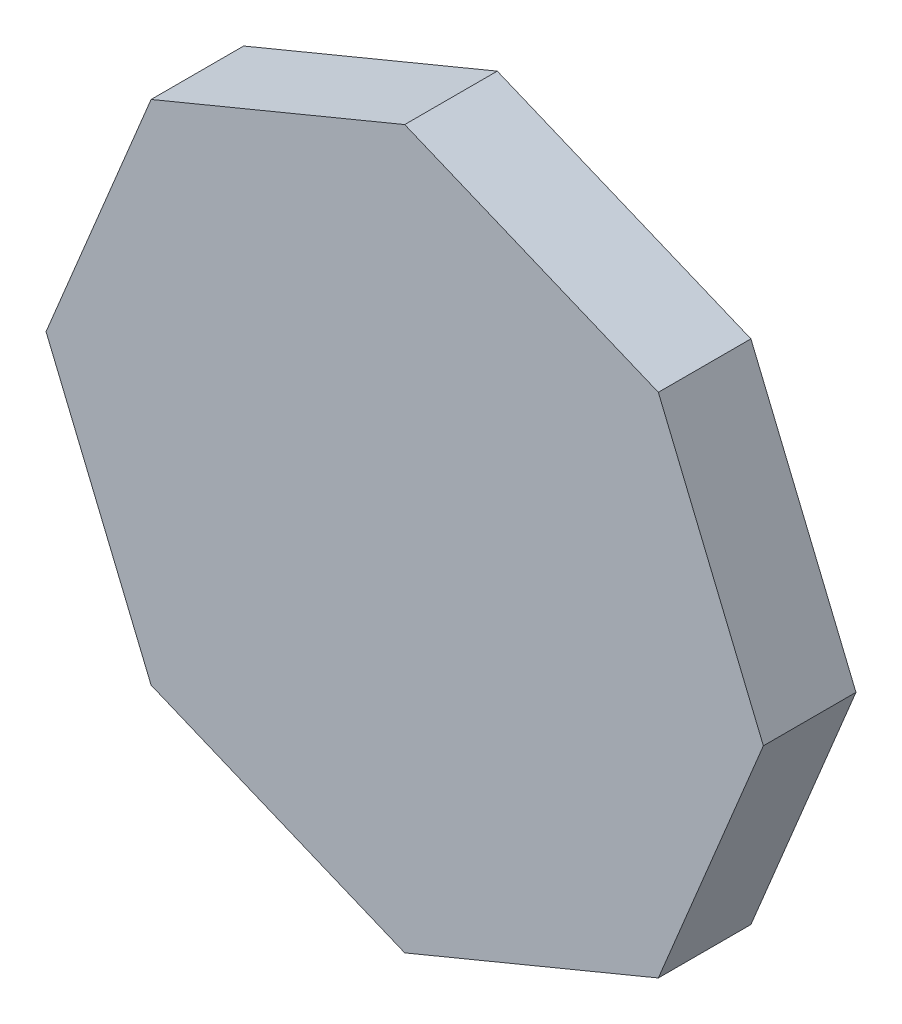
ISO-10303-21;
HEADER;
FILE_DESCRIPTION(('STEP AP214'),'2;1');
FILE_NAME('part.step','',(''),(''),'','','');
FILE_SCHEMA(('AUTOMOTIVE_DESIGN { 1 0 10303 214 1 1 1 1 }'));
ENDSEC;
DATA;
#1=APPLICATION_CONTEXT('core data for automotive mechanical design processes');
#2=APPLICATION_PROTOCOL_DEFINITION('international standard','automotive_design',2000,#1);
#3=PRODUCT_CONTEXT('',#1,'mechanical');
#4=PRODUCT('Part','Part','',(#3));
#5=PRODUCT_RELATED_PRODUCT_CATEGORY('part','',(#4));
#6=PRODUCT_DEFINITION_FORMATION('','',#4);
#7=PRODUCT_DEFINITION_CONTEXT('part definition',#1,'design');
#8=PRODUCT_DEFINITION('design','',#6,#7);
#9=PRODUCT_DEFINITION_SHAPE('','',#8);
#10=(LENGTH_UNIT() NAMED_UNIT(*) SI_UNIT(.MILLI.,.METRE.));
#11=(NAMED_UNIT(*) PLANE_ANGLE_UNIT() SI_UNIT($,.RADIAN.));
#12=(NAMED_UNIT(*) SI_UNIT($,.STERADIAN.) SOLID_ANGLE_UNIT());
#13=UNCERTAINTY_MEASURE_WITH_UNIT(LENGTH_MEASURE(1.E-05),#10,'distance_accuracy_value','');
#14=(GEOMETRIC_REPRESENTATION_CONTEXT(3) GLOBAL_UNCERTAINTY_ASSIGNED_CONTEXT((#13)) GLOBAL_UNIT_ASSIGNED_CONTEXT((#10,
#11,#12)) REPRESENTATION_CONTEXT('',''));
#15=CARTESIAN_POINT('',(0.,0.,0.));
#16=DIRECTION('',(0.,0.,1.));
#17=DIRECTION('',(1.,0.,0.));
#18=AXIS2_PLACEMENT_3D('',#15,#16,#17);
#19=CARTESIAN_POINT('',(21.2669768834007,-21.9203102167827,8.));
#20=DIRECTION('',(-0.923879532511292,0.382683432365078,0.));
#21=DIRECTION('',(-0.382683432365078,-0.923879532511292,0.));
#22=AXIS2_PLACEMENT_3D('',#19,#20,#21);
#23=PLANE('',#22);
#24=DIRECTION('',(0.382683432365078,0.923879532511292,0.));
#25=VECTOR('',#24,1.);
#26=CARTESIAN_POINT('',(21.2669768834007,-21.9203102167827,0.));
#27=LINE('',#26,#25);
#28=CARTESIAN_POINT('',(21.2669768834007,-21.9203102167827,0.));
#29=VERTEX_POINT('',#28);
#30=CARTESIAN_POINT('',(30.3466666666175,4.012823570164E-13,0.));
#31=VERTEX_POINT('',#30);
#32=EDGE_CURVE('E129',#29,#31,#27,.T.);
#33=ORIENTED_EDGE('',*,*,#32,.T.);
#34=DIRECTION('',(0.,0.,-1.));
#35=VECTOR('',#34,1.);
#36=CARTESIAN_POINT('',(30.3466666666175,4.012823570164E-13,8.));
#37=LINE('',#36,#35);
#38=CARTESIAN_POINT('',(30.3466666666175,4.012823570164E-13,8.));
#39=VERTEX_POINT('',#38);
#40=EDGE_CURVE('E11',#39,#31,#37,.T.);
#41=ORIENTED_EDGE('',*,*,#40,.F.);
#42=DIRECTION('',(0.382683432365078,0.923879532511292,0.));
#43=VECTOR('',#42,1.);
#44=CARTESIAN_POINT('',(21.2669768834007,-21.9203102167827,8.));
#45=LINE('',#44,#43);
#46=CARTESIAN_POINT('',(21.2669768834007,-21.9203102167827,8.));
#47=VERTEX_POINT('',#46);
#48=EDGE_CURVE('E143',#47,#39,#45,.T.);
#49=ORIENTED_EDGE('',*,*,#48,.F.);
#50=DIRECTION('',(0.,0.,-1.));
#51=VECTOR('',#50,1.);
#52=CARTESIAN_POINT('',(21.2669768834007,-21.9203102167827,8.));
#53=LINE('',#52,#51);
#54=EDGE_CURVE('E125',#47,#29,#53,.T.);
#55=ORIENTED_EDGE('',*,*,#54,.T.);
#56=EDGE_LOOP('',(#33,#41,#49,#55));
#57=FACE_BOUND('',#56,.T.);
#58=ADVANCED_FACE('F33',(#57),#23,.F.);
#59=CARTESIAN_POINT('',(30.3466666666175,4.012823570164E-13,8.));
#60=DIRECTION('',(-0.923879532511282,-0.382683432365101,0.));
#61=DIRECTION('',(0.382683432365101,-0.923879532511282,0.));
#62=AXIS2_PLACEMENT_3D('',#59,#60,#61);
#63=PLANE('',#62);
#64=DIRECTION('',(-0.382683432365101,0.923879532511282,0.));
#65=VECTOR('',#64,1.);
#66=CARTESIAN_POINT('',(30.3466666666175,4.012823570164E-13,0.));
#67=LINE('',#66,#65);
#68=CARTESIAN_POINT('',(21.2669768834002,21.9203102167833,0.));
#69=VERTEX_POINT('',#68);
#70=EDGE_CURVE('E132',#31,#69,#67,.T.);
#71=ORIENTED_EDGE('',*,*,#70,.T.);
#72=DIRECTION('',(0.,0.,-1.));
#73=VECTOR('',#72,1.);
#74=CARTESIAN_POINT('',(21.2669768834002,21.9203102167833,8.));
#75=LINE('',#74,#73);
#76=CARTESIAN_POINT('',(21.2669768834002,21.9203102167833,8.));
#77=VERTEX_POINT('',#76);
#78=EDGE_CURVE('E41',#77,#69,#75,.T.);
#79=ORIENTED_EDGE('',*,*,#78,.F.);
#80=DIRECTION('',(-0.382683432365101,0.923879532511282,0.));
#81=VECTOR('',#80,1.);
#82=CARTESIAN_POINT('',(30.3466666666175,4.012823570164E-13,8.));
#83=LINE('',#82,#81);
#84=EDGE_CURVE('E92',#39,#77,#83,.T.);
#85=ORIENTED_EDGE('',*,*,#84,.F.);
#86=ORIENTED_EDGE('',*,*,#40,.T.);
#87=EDGE_LOOP('',(#71,#79,#85,#86));
#88=FACE_BOUND('',#87,.T.);
#89=ADVANCED_FACE('F178',(#88),#63,.F.);
#90=CARTESIAN_POINT('',(21.2669768834002,21.9203102167833,8.));
#91=DIRECTION('',(-0.382683432365078,-0.923879532511292,0.));
#92=DIRECTION('',(0.923879532511292,-0.382683432365078,0.));
#93=AXIS2_PLACEMENT_3D('',#90,#91,#92);
#94=PLANE('',#93);
#95=DIRECTION('',(-0.923879532511292,0.382683432365078,0.));
#96=VECTOR('',#95,1.);
#97=CARTESIAN_POINT('',(21.2669768834002,21.9203102167833,0.));
#98=LINE('',#97,#96);
#99=CARTESIAN_POINT('',(-0.653333333382889,31.,0.));
#100=VERTEX_POINT('',#99);
#101=EDGE_CURVE('E134',#69,#100,#98,.T.);
#102=ORIENTED_EDGE('',*,*,#101,.T.);
#103=DIRECTION('',(0.,0.,-1.));
#104=VECTOR('',#103,1.);
#105=CARTESIAN_POINT('',(-0.653333333382889,31.,8.));
#106=LINE('',#105,#104);
#107=CARTESIAN_POINT('',(-0.653333333382889,31.,8.));
#108=VERTEX_POINT('',#107);
#109=EDGE_CURVE('E150',#108,#100,#106,.T.);
#110=ORIENTED_EDGE('',*,*,#109,.F.);
#111=DIRECTION('',(-0.923879532511292,0.382683432365078,0.));
#112=VECTOR('',#111,1.);
#113=CARTESIAN_POINT('',(21.2669768834002,21.9203102167833,8.));
#114=LINE('',#113,#112);
#115=EDGE_CURVE('E158',#77,#108,#114,.T.);
#116=ORIENTED_EDGE('',*,*,#115,.F.);
#117=ORIENTED_EDGE('',*,*,#78,.T.);
#118=EDGE_LOOP('',(#102,#110,#116,#117));
#119=FACE_BOUND('',#118,.T.);
#120=ADVANCED_FACE('F156',(#119),#94,.F.);
#121=CARTESIAN_POINT('',(-0.653333333382889,31.,8.));
#122=DIRECTION('',(0.382683432365101,-0.923879532511282,0.));
#123=DIRECTION('',(0.923879532511282,0.382683432365101,0.));
#124=AXIS2_PLACEMENT_3D('',#121,#122,#123);
#125=PLANE('',#124);
#126=DIRECTION('',(-0.923879532511282,-0.382683432365101,0.));
#127=VECTOR('',#126,1.);
#128=CARTESIAN_POINT('',(-0.653333333382889,31.,0.));
#129=LINE('',#128,#127);
#130=CARTESIAN_POINT('',(-22.5736435501657,21.9203102167827,0.));
#131=VERTEX_POINT('',#130);
#132=EDGE_CURVE('E136',#100,#131,#129,.T.);
#133=ORIENTED_EDGE('',*,*,#132,.T.);
#134=DIRECTION('',(0.,0.,-1.));
#135=VECTOR('',#134,1.);
#136=CARTESIAN_POINT('',(-22.5736435501657,21.9203102167827,8.));
#137=LINE('',#136,#135);
#138=CARTESIAN_POINT('',(-22.5736435501657,21.9203102167827,8.));
#139=VERTEX_POINT('',#138);
#140=EDGE_CURVE('E147',#139,#131,#137,.T.);
#141=ORIENTED_EDGE('',*,*,#140,.F.);
#142=DIRECTION('',(-0.923879532511282,-0.382683432365101,0.));
#143=VECTOR('',#142,1.);
#144=CARTESIAN_POINT('',(-0.653333333382889,31.,8.));
#145=LINE('',#144,#143);
#146=EDGE_CURVE('E170',#108,#139,#145,.T.);
#147=ORIENTED_EDGE('',*,*,#146,.F.);
#148=ORIENTED_EDGE('',*,*,#109,.T.);
#149=EDGE_LOOP('',(#133,#141,#147,#148));
#150=FACE_BOUND('',#149,.T.);
#151=ADVANCED_FACE('F166',(#150),#125,.F.);
#152=CARTESIAN_POINT('',(-22.5736435501657,21.9203102167827,8.));
#153=DIRECTION('',(0.923879532511291,-0.382683432365078,0.));
#154=DIRECTION('',(0.382683432365078,0.923879532511291,0.));
#155=AXIS2_PLACEMENT_3D('',#152,#153,#154);
#156=PLANE('',#155);
#157=DIRECTION('',(-0.382683432365078,-0.923879532511291,0.));
#158=VECTOR('',#157,1.);
#159=CARTESIAN_POINT('',(-22.5736435501657,21.9203102167827,0.));
#160=LINE('',#159,#158);
#161=CARTESIAN_POINT('',(-31.6533333333825,-3.63956225256597E-13,0.));
#162=VERTEX_POINT('',#161);
#163=EDGE_CURVE('E138',#131,#162,#160,.T.);
#164=ORIENTED_EDGE('',*,*,#163,.T.);
#165=DIRECTION('',(0.,0.,-1.));
#166=VECTOR('',#165,1.);
#167=CARTESIAN_POINT('',(-31.6533333333825,-3.63956225256597E-13,8.));
#168=LINE('',#167,#166);
#169=CARTESIAN_POINT('',(-31.6533333333825,-3.63956225256597E-13,8.));
#170=VERTEX_POINT('',#169);
#171=EDGE_CURVE('E120',#170,#162,#168,.T.);
#172=ORIENTED_EDGE('',*,*,#171,.F.);
#173=DIRECTION('',(-0.382683432365078,-0.923879532511291,0.));
#174=VECTOR('',#173,1.);
#175=CARTESIAN_POINT('',(-22.5736435501657,21.9203102167827,8.));
#176=LINE('',#175,#174);
#177=EDGE_CURVE('E111',#139,#170,#176,.T.);
#178=ORIENTED_EDGE('',*,*,#177,.F.);
#179=ORIENTED_EDGE('',*,*,#140,.T.);
#180=EDGE_LOOP('',(#164,#172,#178,#179));
#181=FACE_BOUND('',#180,.T.);
#182=ADVANCED_FACE('F169',(#181),#156,.F.);
#183=CARTESIAN_POINT('',(-31.6533333333825,-3.63956225256597E-13,8.));
#184=DIRECTION('',(0.923879532511282,0.382683432365101,0.));
#185=DIRECTION('',(-0.382683432365101,0.923879532511282,0.));
#186=AXIS2_PLACEMENT_3D('',#183,#184,#185);
#187=PLANE('',#186);
#188=DIRECTION('',(0.382683432365101,-0.923879532511282,0.));
#189=VECTOR('',#188,1.);
#190=CARTESIAN_POINT('',(-31.6533333333825,-3.63956225256597E-13,0.));
#191=LINE('',#190,#189);
#192=CARTESIAN_POINT('',(-22.5736435501652,-21.9203102167832,0.));
#193=VERTEX_POINT('',#192);
#194=EDGE_CURVE('E119',#162,#193,#191,.T.);
#195=ORIENTED_EDGE('',*,*,#194,.T.);
#196=DIRECTION('',(0.,0.,-1.));
#197=VECTOR('',#196,1.);
#198=CARTESIAN_POINT('',(-22.5736435501652,-21.9203102167832,8.));
#199=LINE('',#198,#197);
#200=CARTESIAN_POINT('',(-22.5736435501652,-21.9203102167832,8.));
#201=VERTEX_POINT('',#200);
#202=EDGE_CURVE('E116',#201,#193,#199,.T.);
#203=ORIENTED_EDGE('',*,*,#202,.F.);
#204=DIRECTION('',(0.382683432365101,-0.923879532511282,0.));
#205=VECTOR('',#204,1.);
#206=CARTESIAN_POINT('',(-31.6533333333825,-3.63956225256597E-13,8.));
#207=LINE('',#206,#205);
#208=EDGE_CURVE('E105',#170,#201,#207,.T.);
#209=ORIENTED_EDGE('',*,*,#208,.F.);
#210=ORIENTED_EDGE('',*,*,#171,.T.);
#211=EDGE_LOOP('',(#195,#203,#209,#210));
#212=FACE_BOUND('',#211,.T.);
#213=ADVANCED_FACE('F117',(#212),#187,.F.);
#214=CARTESIAN_POINT('',(-22.5736435501652,-21.9203102167832,8.));
#215=DIRECTION('',(0.382683432365078,0.923879532511292,0.));
#216=DIRECTION('',(-0.923879532511292,0.382683432365078,0.));
#217=AXIS2_PLACEMENT_3D('',#214,#215,#216);
#218=PLANE('',#217);
#219=DIRECTION('',(0.923879532511292,-0.382683432365078,0.));
#220=VECTOR('',#219,1.);
#221=CARTESIAN_POINT('',(-22.5736435501652,-21.9203102167832,0.));
#222=LINE('',#221,#220);
#223=CARTESIAN_POINT('',(-0.653333333382117,-31.,0.));
#224=VERTEX_POINT('',#223);
#225=EDGE_CURVE('E78',#193,#224,#222,.T.);
#226=ORIENTED_EDGE('',*,*,#225,.T.);
#227=DIRECTION('',(0.,0.,-1.));
#228=VECTOR('',#227,1.);
#229=CARTESIAN_POINT('',(-0.653333333382117,-31.,8.));
#230=LINE('',#229,#228);
#231=CARTESIAN_POINT('',(-0.653333333382117,-31.,8.));
#232=VERTEX_POINT('',#231);
#233=EDGE_CURVE('E121',#232,#224,#230,.T.);
#234=ORIENTED_EDGE('',*,*,#233,.F.);
#235=DIRECTION('',(0.923879532511292,-0.382683432365078,0.));
#236=VECTOR('',#235,1.);
#237=CARTESIAN_POINT('',(-22.5736435501652,-21.9203102167832,8.));
#238=LINE('',#237,#236);
#239=EDGE_CURVE('E109',#201,#232,#238,.T.);
#240=ORIENTED_EDGE('',*,*,#239,.F.);
#241=ORIENTED_EDGE('',*,*,#202,.T.);
#242=EDGE_LOOP('',(#226,#234,#240,#241));
#243=FACE_BOUND('',#242,.T.);
#244=ADVANCED_FACE('F123',(#243),#218,.F.);
#245=CARTESIAN_POINT('',(-0.653333333382117,-31.,8.));
#246=DIRECTION('',(-0.382683432365101,0.923879532511282,0.));
#247=DIRECTION('',(-0.923879532511282,-0.382683432365101,0.));
#248=AXIS2_PLACEMENT_3D('',#245,#246,#247);
#249=PLANE('',#248);
#250=DIRECTION('',(0.923879532511282,0.382683432365101,0.));
#251=VECTOR('',#250,1.);
#252=CARTESIAN_POINT('',(-0.653333333382117,-31.,0.));
#253=LINE('',#252,#251);
#254=EDGE_CURVE('E84',#224,#29,#253,.T.);
#255=ORIENTED_EDGE('',*,*,#254,.T.);
#256=ORIENTED_EDGE('',*,*,#54,.F.);
#257=DIRECTION('',(0.923879532511282,0.382683432365101,0.));
#258=VECTOR('',#257,1.);
#259=CARTESIAN_POINT('',(-0.653333333382117,-31.,8.));
#260=LINE('',#259,#258);
#261=EDGE_CURVE('E49',#232,#47,#260,.T.);
#262=ORIENTED_EDGE('',*,*,#261,.F.);
#263=ORIENTED_EDGE('',*,*,#233,.T.);
#264=EDGE_LOOP('',(#255,#256,#262,#263));
#265=FACE_BOUND('',#264,.T.);
#266=ADVANCED_FACE('F194',(#265),#249,.F.);
#267=CARTESIAN_POINT('',(0.,0.,8.));
#268=DIRECTION('',(0.,0.,1.));
#269=DIRECTION('',(1.,0.,0.));
#270=AXIS2_PLACEMENT_3D('',#267,#268,#269);
#271=PLANE('',#270);
#272=ORIENTED_EDGE('',*,*,#48,.T.);
#273=ORIENTED_EDGE('',*,*,#84,.T.);
#274=ORIENTED_EDGE('',*,*,#115,.T.);
#275=ORIENTED_EDGE('',*,*,#146,.T.);
#276=ORIENTED_EDGE('',*,*,#177,.T.);
#277=ORIENTED_EDGE('',*,*,#208,.T.);
#278=ORIENTED_EDGE('',*,*,#239,.T.);
#279=ORIENTED_EDGE('',*,*,#261,.T.);
#280=EDGE_LOOP('',(#272,#273,#274,#275,#276,#277,#278,#279));
#281=FACE_BOUND('',#280,.T.);
#282=ADVANCED_FACE('F107',(#281),#271,.T.);
#283=CARTESIAN_POINT('',(0.,0.,0.));
#284=DIRECTION('',(0.,0.,1.));
#285=DIRECTION('',(1.,0.,0.));
#286=AXIS2_PLACEMENT_3D('',#283,#284,#285);
#287=PLANE('',#286);
#288=ORIENTED_EDGE('',*,*,#32,.F.);
#289=ORIENTED_EDGE('',*,*,#254,.F.);
#290=ORIENTED_EDGE('',*,*,#225,.F.);
#291=ORIENTED_EDGE('',*,*,#194,.F.);
#292=ORIENTED_EDGE('',*,*,#163,.F.);
#293=ORIENTED_EDGE('',*,*,#132,.F.);
#294=ORIENTED_EDGE('',*,*,#101,.F.);
#295=ORIENTED_EDGE('',*,*,#70,.F.);
#296=EDGE_LOOP('',(#288,#289,#290,#291,#292,#293,#294,#295));
#297=FACE_BOUND('',#296,.T.);
#298=ADVANCED_FACE('F162',(#297),#287,.F.);
#299=CLOSED_SHELL('',(#58,#89,#120,#151,#182,#213,#244,#266,#282,#298));
#300=MANIFOLD_SOLID_BREP('B2',#299);
#301=ADVANCED_BREP_SHAPE_REPRESENTATION('',(#18,#300),#14);
#302=SHAPE_DEFINITION_REPRESENTATION(#9,#301);
ENDSEC;
END-ISO-10303-21;
